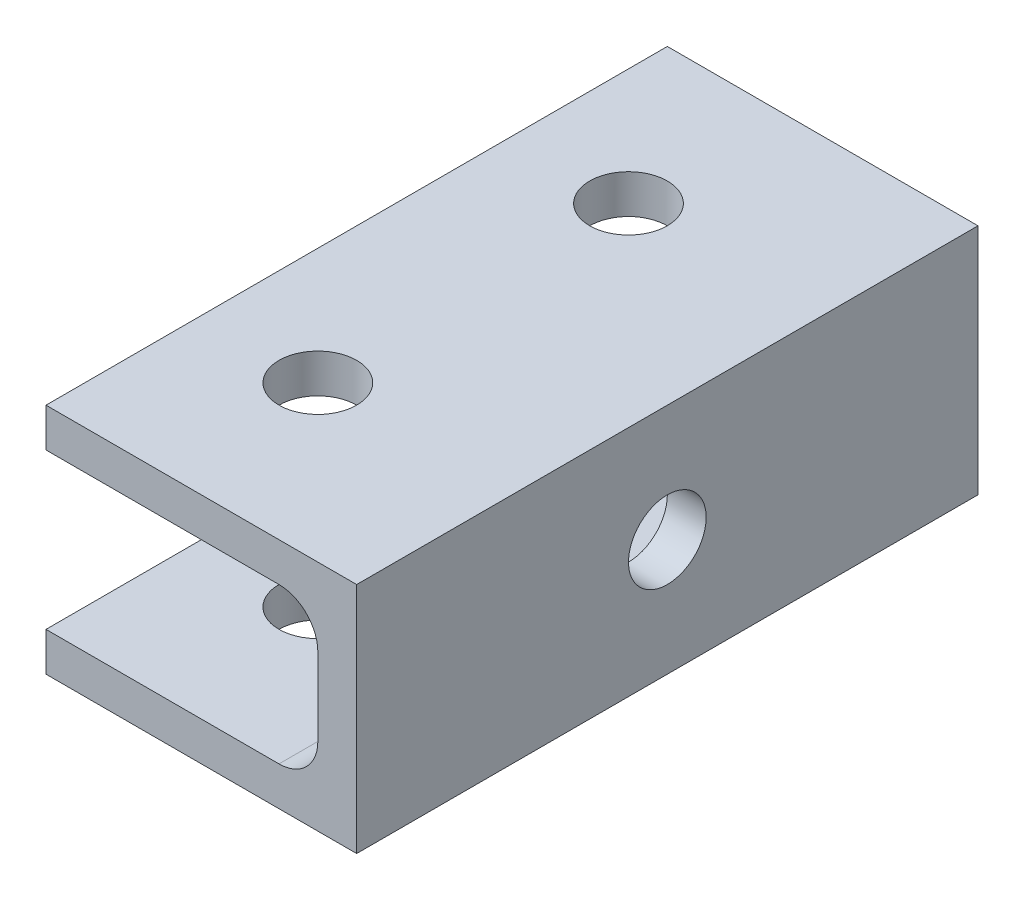
ISO-10303-21;
HEADER;
FILE_DESCRIPTION(('STEP AP214'),'2;1');
FILE_NAME('part.step','',(''),(''),'','','');
FILE_SCHEMA(('AUTOMOTIVE_DESIGN { 1 0 10303 214 1 1 1 1 }'));
ENDSEC;
DATA;
#1=APPLICATION_CONTEXT('core data for automotive mechanical design processes');
#2=APPLICATION_PROTOCOL_DEFINITION('international standard','automotive_design',2000,#1);
#3=PRODUCT_CONTEXT('',#1,'mechanical');
#4=PRODUCT('Part','Part','',(#3));
#5=PRODUCT_RELATED_PRODUCT_CATEGORY('part','',(#4));
#6=PRODUCT_DEFINITION_FORMATION('','',#4);
#7=PRODUCT_DEFINITION_CONTEXT('part definition',#1,'design');
#8=PRODUCT_DEFINITION('design','',#6,#7);
#9=PRODUCT_DEFINITION_SHAPE('','',#8);
#10=(LENGTH_UNIT() NAMED_UNIT(*) SI_UNIT(.MILLI.,.METRE.));
#11=(NAMED_UNIT(*) PLANE_ANGLE_UNIT() SI_UNIT($,.RADIAN.));
#12=(NAMED_UNIT(*) SI_UNIT($,.STERADIAN.) SOLID_ANGLE_UNIT());
#13=UNCERTAINTY_MEASURE_WITH_UNIT(LENGTH_MEASURE(1.E-05),#10,'distance_accuracy_value','');
#14=(GEOMETRIC_REPRESENTATION_CONTEXT(3) GLOBAL_UNCERTAINTY_ASSIGNED_CONTEXT((#13)) GLOBAL_UNIT_ASSIGNED_CONTEXT((#10,
#11,#12)) REPRESENTATION_CONTEXT('',''));
#15=CARTESIAN_POINT('',(0.,0.,0.));
#16=DIRECTION('',(0.,0.,1.));
#17=DIRECTION('',(1.,0.,0.));
#18=AXIS2_PLACEMENT_3D('',#15,#16,#17);
#19=CARTESIAN_POINT('',(35.,0.,80.));
#20=DIRECTION('',(1.,0.,0.));
#21=DIRECTION('',(0.,1.,0.));
#22=AXIS2_PLACEMENT_3D('',#19,#20,#21);
#23=PLANE('',#22);
#24=DIRECTION('',(0.,0.,-1.));
#25=VECTOR('',#24,1.);
#26=CARTESIAN_POINT('',(35.,-5.,0.));
#27=LINE('',#26,#25);
#28=CARTESIAN_POINT('',(35.,-5.,80.));
#29=VERTEX_POINT('',#28);
#30=CARTESIAN_POINT('',(35.,-5.,40.));
#31=VERTEX_POINT('',#30);
#32=EDGE_CURVE('E127',#29,#31,#27,.T.);
#33=ORIENTED_EDGE('',*,*,#32,.T.);
#34=CARTESIAN_POINT('',(35.,-10.,40.));
#35=DIRECTION('',(1.,0.,0.));
#36=DIRECTION('',(0.,1.,0.));
#37=AXIS2_PLACEMENT_3D('',#34,#35,#36);
#38=CIRCLE('',#37,5.);
#39=CARTESIAN_POINT('',(35.,-15.,40.));
#40=VERTEX_POINT('',#39);
#41=EDGE_CURVE('E47',#31,#40,#38,.T.);
#42=ORIENTED_EDGE('',*,*,#41,.T.);
#43=DIRECTION('',(0.,0.,-1.));
#44=VECTOR('',#43,1.);
#45=CARTESIAN_POINT('',(35.,-15.,80.));
#46=LINE('',#45,#44);
#47=CARTESIAN_POINT('',(35.,-15.,80.));
#48=VERTEX_POINT('',#47);
#49=EDGE_CURVE('E124',#40,#48,#46,.F.);
#50=ORIENTED_EDGE('',*,*,#49,.T.);
#51=DIRECTION('',(0.,-1.,0.));
#52=VECTOR('',#51,1.);
#53=CARTESIAN_POINT('',(35.,0.,80.));
#54=LINE('',#53,#52);
#55=EDGE_CURVE('E165',#29,#48,#54,.T.);
#56=ORIENTED_EDGE('',*,*,#55,.F.);
#57=EDGE_LOOP('',(#33,#42,#50,#56));
#58=FACE_BOUND('',#57,.T.);
#59=ADVANCED_FACE('F33',(#58),#23,.F.);
#60=CARTESIAN_POINT('',(0.,0.,80.));
#61=DIRECTION('',(0.,1.,0.));
#62=DIRECTION('',(0.,0.,1.));
#63=AXIS2_PLACEMENT_3D('',#60,#61,#62);
#64=PLANE('',#63);
#65=DIRECTION('',(1.,0.,0.));
#66=VECTOR('',#65,1.);
#67=CARTESIAN_POINT('',(0.,0.,0.));
#68=LINE('',#67,#66);
#69=CARTESIAN_POINT('',(0.,0.,0.));
#70=VERTEX_POINT('',#69);
#71=CARTESIAN_POINT('',(30.,0.,0.));
#72=VERTEX_POINT('',#71);
#73=EDGE_CURVE('E151',#70,#72,#68,.T.);
#74=ORIENTED_EDGE('',*,*,#73,.T.);
#75=DIRECTION('',(0.,0.,-1.));
#76=VECTOR('',#75,1.);
#77=CARTESIAN_POINT('',(30.,0.,80.));
#78=LINE('',#77,#76);
#79=CARTESIAN_POINT('',(30.,0.,80.));
#80=VERTEX_POINT('',#79);
#81=EDGE_CURVE('E55',#72,#80,#78,.F.);
#82=ORIENTED_EDGE('',*,*,#81,.T.);
#83=DIRECTION('',(1.,0.,0.));
#84=VECTOR('',#83,1.);
#85=CARTESIAN_POINT('',(0.,0.,80.));
#86=LINE('',#85,#84);
#87=CARTESIAN_POINT('',(0.,0.,80.));
#88=VERTEX_POINT('',#87);
#89=EDGE_CURVE('E166',#88,#80,#86,.T.);
#90=ORIENTED_EDGE('',*,*,#89,.F.);
#91=DIRECTION('',(0.,0.,-1.));
#92=VECTOR('',#91,1.);
#93=CARTESIAN_POINT('',(0.,0.,80.));
#94=LINE('',#93,#92);
#95=EDGE_CURVE('E157',#88,#70,#94,.T.);
#96=ORIENTED_EDGE('',*,*,#95,.T.);
#97=EDGE_LOOP('',(#74,#82,#90,#96));
#98=FACE_BOUND('',#97,.T.);
#99=CARTESIAN_POINT('',(15.,0.,20.));
#100=DIRECTION('',(0.,1.,0.));
#101=DIRECTION('',(0.,0.,1.));
#102=AXIS2_PLACEMENT_3D('',#99,#100,#101);
#103=CIRCLE('',#102,5.);
#104=CARTESIAN_POINT('',(15.,0.,25.));
#105=VERTEX_POINT('',#104);
#106=EDGE_CURVE('E253',#105,#105,#103,.F.);
#107=ORIENTED_EDGE('',*,*,#106,.F.);
#108=EDGE_LOOP('',(#107));
#109=FACE_BOUND('',#108,.T.);
#110=CARTESIAN_POINT('',(15.,0.,60.));
#111=DIRECTION('',(0.,1.,0.));
#112=DIRECTION('',(0.,0.,1.));
#113=AXIS2_PLACEMENT_3D('',#110,#111,#112);
#114=CIRCLE('',#113,5.);
#115=CARTESIAN_POINT('',(15.,0.,65.));
#116=VERTEX_POINT('',#115);
#117=EDGE_CURVE('E183',#116,#116,#114,.T.);
#118=ORIENTED_EDGE('',*,*,#117,.T.);
#119=EDGE_LOOP('',(#118));
#120=FACE_BOUND('',#119,.T.);
#121=ADVANCED_FACE('F154',(#98,#109,#120),#64,.F.);
#122=CARTESIAN_POINT('',(35.,-20.,80.));
#123=DIRECTION('',(0.,-1.,0.));
#124=DIRECTION('',(1.,0.,0.));
#125=AXIS2_PLACEMENT_3D('',#122,#123,#124);
#126=PLANE('',#125);
#127=DIRECTION('',(-1.,0.,0.));
#128=VECTOR('',#127,1.);
#129=CARTESIAN_POINT('',(35.,-20.,80.));
#130=LINE('',#129,#128);
#131=CARTESIAN_POINT('',(30.,-20.,80.));
#132=VERTEX_POINT('',#131);
#133=CARTESIAN_POINT('',(0.,-20.,80.));
#134=VERTEX_POINT('',#133);
#135=EDGE_CURVE('E167',#132,#134,#130,.T.);
#136=ORIENTED_EDGE('',*,*,#135,.F.);
#137=DIRECTION('',(0.,0.,-1.));
#138=VECTOR('',#137,1.);
#139=CARTESIAN_POINT('',(30.,-20.,0.));
#140=LINE('',#139,#138);
#141=CARTESIAN_POINT('',(30.,-20.,0.));
#142=VERTEX_POINT('',#141);
#143=EDGE_CURVE('E210',#132,#142,#140,.T.);
#144=ORIENTED_EDGE('',*,*,#143,.T.);
#145=DIRECTION('',(-1.,0.,0.));
#146=VECTOR('',#145,1.);
#147=CARTESIAN_POINT('',(35.,-20.,0.));
#148=LINE('',#147,#146);
#149=CARTESIAN_POINT('',(0.,-20.,0.));
#150=VERTEX_POINT('',#149);
#151=EDGE_CURVE('E186',#142,#150,#148,.T.);
#152=ORIENTED_EDGE('',*,*,#151,.T.);
#153=DIRECTION('',(0.,0.,-1.));
#154=VECTOR('',#153,1.);
#155=CARTESIAN_POINT('',(0.,-20.,80.));
#156=LINE('',#155,#154);
#157=EDGE_CURVE('E207',#134,#150,#156,.T.);
#158=ORIENTED_EDGE('',*,*,#157,.F.);
#159=EDGE_LOOP('',(#136,#144,#152,#158));
#160=FACE_BOUND('',#159,.T.);
#161=CARTESIAN_POINT('',(15.,-20.,20.));
#162=DIRECTION('',(0.,-1.,0.));
#163=DIRECTION('',(1.,0.,0.));
#164=AXIS2_PLACEMENT_3D('',#161,#162,#163);
#165=CIRCLE('',#164,5.);
#166=CARTESIAN_POINT('',(20.,-20.,20.));
#167=VERTEX_POINT('',#166);
#168=EDGE_CURVE('E256',#167,#167,#165,.F.);
#169=ORIENTED_EDGE('',*,*,#168,.F.);
#170=EDGE_LOOP('',(#169));
#171=FACE_BOUND('',#170,.T.);
#172=CARTESIAN_POINT('',(15.,-20.,60.));
#173=DIRECTION('',(0.,-1.,0.));
#174=DIRECTION('',(1.,0.,0.));
#175=AXIS2_PLACEMENT_3D('',#172,#173,#174);
#176=CIRCLE('',#175,5.);
#177=CARTESIAN_POINT('',(20.,-20.,60.));
#178=VERTEX_POINT('',#177);
#179=EDGE_CURVE('E247',#178,#178,#176,.T.);
#180=ORIENTED_EDGE('',*,*,#179,.T.);
#181=EDGE_LOOP('',(#180));
#182=FACE_BOUND('',#181,.T.);
#183=ADVANCED_FACE('F216',(#160,#171,#182),#126,.F.);
#184=CARTESIAN_POINT('',(0.,-25.,80.));
#185=DIRECTION('',(0.,1.,0.));
#186=DIRECTION('',(0.,0.,1.));
#187=AXIS2_PLACEMENT_3D('',#184,#185,#186);
#188=PLANE('',#187);
#189=DIRECTION('',(1.,0.,0.));
#190=VECTOR('',#189,1.);
#191=CARTESIAN_POINT('',(0.,-25.,0.));
#192=LINE('',#191,#190);
#193=CARTESIAN_POINT('',(0.,-25.,0.));
#194=VERTEX_POINT('',#193);
#195=CARTESIAN_POINT('',(40.,-25.,0.));
#196=VERTEX_POINT('',#195);
#197=EDGE_CURVE('E190',#194,#196,#192,.T.);
#198=ORIENTED_EDGE('',*,*,#197,.T.);
#199=DIRECTION('',(0.,0.,-1.));
#200=VECTOR('',#199,1.);
#201=CARTESIAN_POINT('',(40.,-25.,80.));
#202=LINE('',#201,#200);
#203=CARTESIAN_POINT('',(40.,-25.,80.));
#204=VERTEX_POINT('',#203);
#205=EDGE_CURVE('E201',#204,#196,#202,.T.);
#206=ORIENTED_EDGE('',*,*,#205,.F.);
#207=DIRECTION('',(1.,0.,0.));
#208=VECTOR('',#207,1.);
#209=CARTESIAN_POINT('',(0.,-25.,80.));
#210=LINE('',#209,#208);
#211=CARTESIAN_POINT('',(0.,-25.,80.));
#212=VERTEX_POINT('',#211);
#213=EDGE_CURVE('E176',#212,#204,#210,.T.);
#214=ORIENTED_EDGE('',*,*,#213,.F.);
#215=DIRECTION('',(0.,0.,-1.));
#216=VECTOR('',#215,1.);
#217=CARTESIAN_POINT('',(0.,-25.,80.));
#218=LINE('',#217,#216);
#219=EDGE_CURVE('E204',#212,#194,#218,.T.);
#220=ORIENTED_EDGE('',*,*,#219,.T.);
#221=EDGE_LOOP('',(#198,#206,#214,#220));
#222=FACE_BOUND('',#221,.T.);
#223=CARTESIAN_POINT('',(15.,-25.,20.));
#224=DIRECTION('',(0.,1.,0.));
#225=DIRECTION('',(0.,0.,1.));
#226=AXIS2_PLACEMENT_3D('',#223,#224,#225);
#227=CIRCLE('',#226,5.);
#228=CARTESIAN_POINT('',(15.,-25.,25.));
#229=VERTEX_POINT('',#228);
#230=EDGE_CURVE('E259',#229,#229,#227,.F.);
#231=ORIENTED_EDGE('',*,*,#230,.F.);
#232=EDGE_LOOP('',(#231));
#233=FACE_BOUND('',#232,.T.);
#234=CARTESIAN_POINT('',(15.,-25.,60.));
#235=DIRECTION('',(0.,1.,0.));
#236=DIRECTION('',(0.,0.,1.));
#237=AXIS2_PLACEMENT_3D('',#234,#235,#236);
#238=CIRCLE('',#237,5.);
#239=CARTESIAN_POINT('',(15.,-25.,65.));
#240=VERTEX_POINT('',#239);
#241=EDGE_CURVE('E250',#240,#240,#238,.T.);
#242=ORIENTED_EDGE('',*,*,#241,.T.);
#243=EDGE_LOOP('',(#242));
#244=FACE_BOUND('',#243,.T.);
#245=ADVANCED_FACE('F228',(#222,#233,#244),#188,.F.);
#246=CARTESIAN_POINT('',(40.,5.00000000000001,80.));
#247=DIRECTION('',(0.,-1.,0.));
#248=DIRECTION('',(1.,0.,0.));
#249=AXIS2_PLACEMENT_3D('',#246,#247,#248);
#250=PLANE('',#249);
#251=DIRECTION('',(-1.,0.,0.));
#252=VECTOR('',#251,1.);
#253=CARTESIAN_POINT('',(40.,5.00000000000001,0.));
#254=LINE('',#253,#252);
#255=CARTESIAN_POINT('',(40.,5.00000000000001,0.));
#256=VERTEX_POINT('',#255);
#257=CARTESIAN_POINT('',(0.,5.,0.));
#258=VERTEX_POINT('',#257);
#259=EDGE_CURVE('E194',#256,#258,#254,.T.);
#260=ORIENTED_EDGE('',*,*,#259,.T.);
#261=DIRECTION('',(0.,0.,-1.));
#262=VECTOR('',#261,1.);
#263=CARTESIAN_POINT('',(0.,5.,80.));
#264=LINE('',#263,#262);
#265=CARTESIAN_POINT('',(0.,5.,80.));
#266=VERTEX_POINT('',#265);
#267=EDGE_CURVE('E182',#266,#258,#264,.T.);
#268=ORIENTED_EDGE('',*,*,#267,.F.);
#269=DIRECTION('',(-1.,0.,0.));
#270=VECTOR('',#269,1.);
#271=CARTESIAN_POINT('',(40.,5.00000000000001,80.));
#272=LINE('',#271,#270);
#273=CARTESIAN_POINT('',(40.,5.00000000000001,80.));
#274=VERTEX_POINT('',#273);
#275=EDGE_CURVE('E180',#274,#266,#272,.T.);
#276=ORIENTED_EDGE('',*,*,#275,.F.);
#277=DIRECTION('',(0.,0.,-1.));
#278=VECTOR('',#277,1.);
#279=CARTESIAN_POINT('',(40.,5.00000000000001,80.));
#280=LINE('',#279,#278);
#281=EDGE_CURVE('E198',#274,#256,#280,.T.);
#282=ORIENTED_EDGE('',*,*,#281,.T.);
#283=EDGE_LOOP('',(#260,#268,#276,#282));
#284=FACE_BOUND('',#283,.T.);
#285=CARTESIAN_POINT('',(15.,5.,20.));
#286=DIRECTION('',(0.,-1.,0.));
#287=DIRECTION('',(1.,0.,0.));
#288=AXIS2_PLACEMENT_3D('',#285,#286,#287);
#289=CIRCLE('',#288,5.);
#290=CARTESIAN_POINT('',(20.,5.,20.));
#291=VERTEX_POINT('',#290);
#292=EDGE_CURVE('E128',#291,#291,#289,.T.);
#293=ORIENTED_EDGE('',*,*,#292,.T.);
#294=EDGE_LOOP('',(#293));
#295=FACE_BOUND('',#294,.T.);
#296=CARTESIAN_POINT('',(15.,5.,60.));
#297=DIRECTION('',(0.,1.,0.));
#298=DIRECTION('',(-1.,0.,0.));
#299=AXIS2_PLACEMENT_3D('',#296,#297,#298);
#300=CIRCLE('',#299,5.);
#301=CARTESIAN_POINT('',(10.,5.,60.));
#302=VERTEX_POINT('',#301);
#303=EDGE_CURVE('E262',#302,#302,#300,.T.);
#304=ORIENTED_EDGE('',*,*,#303,.F.);
#305=EDGE_LOOP('',(#304));
#306=FACE_BOUND('',#305,.T.);
#307=ADVANCED_FACE('F239',(#284,#295,#306),#250,.F.);
#308=CARTESIAN_POINT('',(0.,5.,80.));
#309=DIRECTION('',(1.,0.,0.));
#310=DIRECTION('',(0.,0.,-1.));
#311=AXIS2_PLACEMENT_3D('',#308,#309,#310);
#312=PLANE('',#311);
#313=DIRECTION('',(0.,-1.,0.));
#314=VECTOR('',#313,1.);
#315=CARTESIAN_POINT('',(0.,5.,0.));
#316=LINE('',#315,#314);
#317=EDGE_CURVE('E159',#258,#70,#316,.T.);
#318=ORIENTED_EDGE('',*,*,#317,.T.);
#319=ORIENTED_EDGE('',*,*,#95,.F.);
#320=DIRECTION('',(0.,-1.,0.));
#321=VECTOR('',#320,1.);
#322=CARTESIAN_POINT('',(0.,5.,80.));
#323=LINE('',#322,#321);
#324=EDGE_CURVE('E171',#266,#88,#323,.T.);
#325=ORIENTED_EDGE('',*,*,#324,.F.);
#326=ORIENTED_EDGE('',*,*,#267,.T.);
#327=EDGE_LOOP('',(#318,#319,#325,#326));
#328=FACE_BOUND('',#327,.T.);
#329=ADVANCED_FACE('F243',(#328),#312,.F.);
#330=CARTESIAN_POINT('',(35.,-15.,0.));
#331=VERTEX_POINT('',#330);
#332=EDGE_CURVE('E133',#331,#40,#46,.F.);
#333=ORIENTED_EDGE('',*,*,#332,.T.);
#334=EDGE_CURVE('E113',#40,#31,#38,.T.);
#335=ORIENTED_EDGE('',*,*,#334,.T.);
#336=CARTESIAN_POINT('',(35.,-5.,0.));
#337=VERTEX_POINT('',#336);
#338=EDGE_CURVE('E212',#31,#337,#27,.T.);
#339=ORIENTED_EDGE('',*,*,#338,.T.);
#340=DIRECTION('',(0.,-1.,0.));
#341=VECTOR('',#340,1.);
#342=CARTESIAN_POINT('',(35.,0.,0.));
#343=LINE('',#342,#341);
#344=EDGE_CURVE('E140',#337,#331,#343,.T.);
#345=ORIENTED_EDGE('',*,*,#344,.T.);
#346=EDGE_LOOP('',(#333,#335,#339,#345));
#347=FACE_BOUND('',#346,.T.);
#348=ADVANCED_FACE('F138',(#347),#23,.F.);
#349=CARTESIAN_POINT('',(0.,-20.,80.));
#350=DIRECTION('',(1.,0.,0.));
#351=DIRECTION('',(0.,1.,0.));
#352=AXIS2_PLACEMENT_3D('',#349,#350,#351);
#353=PLANE('',#352);
#354=DIRECTION('',(0.,-1.,0.));
#355=VECTOR('',#354,1.);
#356=CARTESIAN_POINT('',(0.,-20.,0.));
#357=LINE('',#356,#355);
#358=EDGE_CURVE('E188',#150,#194,#357,.T.);
#359=ORIENTED_EDGE('',*,*,#358,.T.);
#360=ORIENTED_EDGE('',*,*,#219,.F.);
#361=DIRECTION('',(0.,-1.,0.));
#362=VECTOR('',#361,1.);
#363=CARTESIAN_POINT('',(0.,-20.,80.));
#364=LINE('',#363,#362);
#365=EDGE_CURVE('E169',#134,#212,#364,.T.);
#366=ORIENTED_EDGE('',*,*,#365,.F.);
#367=ORIENTED_EDGE('',*,*,#157,.T.);
#368=EDGE_LOOP('',(#359,#360,#366,#367));
#369=FACE_BOUND('',#368,.T.);
#370=ADVANCED_FACE('F224',(#369),#353,.F.);
#371=CARTESIAN_POINT('',(40.,-25.,80.));
#372=DIRECTION('',(-1.,0.,0.));
#373=DIRECTION('',(0.,0.,1.));
#374=AXIS2_PLACEMENT_3D('',#371,#372,#373);
#375=PLANE('',#374);
#376=CARTESIAN_POINT('',(40.,-10.,40.));
#377=DIRECTION('',(1.,0.,0.));
#378=DIRECTION('',(0.,0.,-1.));
#379=AXIS2_PLACEMENT_3D('',#376,#377,#378);
#380=CIRCLE('',#379,5.);
#381=CARTESIAN_POINT('',(40.,-10.,35.));
#382=VERTEX_POINT('',#381);
#383=EDGE_CURVE('E118',#382,#382,#380,.T.);
#384=ORIENTED_EDGE('',*,*,#383,.F.);
#385=EDGE_LOOP('',(#384));
#386=FACE_BOUND('',#385,.T.);
#387=DIRECTION('',(0.,1.,0.));
#388=VECTOR('',#387,1.);
#389=CARTESIAN_POINT('',(40.,-25.,0.));
#390=LINE('',#389,#388);
#391=EDGE_CURVE('E192',#196,#256,#390,.T.);
#392=ORIENTED_EDGE('',*,*,#391,.T.);
#393=ORIENTED_EDGE('',*,*,#281,.F.);
#394=DIRECTION('',(0.,1.,0.));
#395=VECTOR('',#394,1.);
#396=CARTESIAN_POINT('',(40.,-25.,80.));
#397=LINE('',#396,#395);
#398=EDGE_CURVE('E178',#204,#274,#397,.T.);
#399=ORIENTED_EDGE('',*,*,#398,.F.);
#400=ORIENTED_EDGE('',*,*,#205,.T.);
#401=EDGE_LOOP('',(#392,#393,#399,#400));
#402=FACE_BOUND('',#401,.T.);
#403=ADVANCED_FACE('F236',(#386,#402),#375,.F.);
#404=CARTESIAN_POINT('',(0.,0.,80.));
#405=DIRECTION('',(0.,0.,1.));
#406=DIRECTION('',(1.,0.,0.));
#407=AXIS2_PLACEMENT_3D('',#404,#405,#406);
#408=PLANE('',#407);
#409=ORIENTED_EDGE('',*,*,#324,.T.);
#410=ORIENTED_EDGE('',*,*,#89,.T.);
#411=CARTESIAN_POINT('',(30.,-5.,80.));
#412=DIRECTION('',(0.,0.,1.));
#413=DIRECTION('',(1.,0.,0.));
#414=AXIS2_PLACEMENT_3D('',#411,#412,#413);
#415=CIRCLE('',#414,5.);
#416=EDGE_CURVE('E11',#80,#29,#415,.F.);
#417=ORIENTED_EDGE('',*,*,#416,.T.);
#418=ORIENTED_EDGE('',*,*,#55,.T.);
#419=CARTESIAN_POINT('',(30.,-15.,80.));
#420=DIRECTION('',(0.,0.,1.));
#421=DIRECTION('',(1.,0.,0.));
#422=AXIS2_PLACEMENT_3D('',#419,#420,#421);
#423=CIRCLE('',#422,5.);
#424=EDGE_CURVE('E135',#48,#132,#423,.F.);
#425=ORIENTED_EDGE('',*,*,#424,.T.);
#426=ORIENTED_EDGE('',*,*,#135,.T.);
#427=ORIENTED_EDGE('',*,*,#365,.T.);
#428=ORIENTED_EDGE('',*,*,#213,.T.);
#429=ORIENTED_EDGE('',*,*,#398,.T.);
#430=ORIENTED_EDGE('',*,*,#275,.T.);
#431=EDGE_LOOP('',(#409,#410,#417,#418,#425,#426,#427,#428,#429,#430));
#432=FACE_BOUND('',#431,.T.);
#433=ADVANCED_FACE('F164',(#432),#408,.T.);
#434=CARTESIAN_POINT('',(0.,0.,0.));
#435=DIRECTION('',(0.,0.,1.));
#436=DIRECTION('',(1.,0.,0.));
#437=AXIS2_PLACEMENT_3D('',#434,#435,#436);
#438=PLANE('',#437);
#439=ORIENTED_EDGE('',*,*,#317,.F.);
#440=ORIENTED_EDGE('',*,*,#259,.F.);
#441=ORIENTED_EDGE('',*,*,#391,.F.);
#442=ORIENTED_EDGE('',*,*,#197,.F.);
#443=ORIENTED_EDGE('',*,*,#358,.F.);
#444=ORIENTED_EDGE('',*,*,#151,.F.);
#445=CARTESIAN_POINT('',(30.,-15.,0.));
#446=DIRECTION('',(0.,0.,1.));
#447=DIRECTION('',(1.,0.,0.));
#448=AXIS2_PLACEMENT_3D('',#445,#446,#447);
#449=CIRCLE('',#448,5.);
#450=EDGE_CURVE('E141',#142,#331,#449,.T.);
#451=ORIENTED_EDGE('',*,*,#450,.T.);
#452=ORIENTED_EDGE('',*,*,#344,.F.);
#453=CARTESIAN_POINT('',(30.,-5.,0.));
#454=DIRECTION('',(0.,0.,1.));
#455=DIRECTION('',(1.,0.,0.));
#456=AXIS2_PLACEMENT_3D('',#453,#454,#455);
#457=CIRCLE('',#456,5.);
#458=EDGE_CURVE('E41',#337,#72,#457,.T.);
#459=ORIENTED_EDGE('',*,*,#458,.T.);
#460=ORIENTED_EDGE('',*,*,#73,.F.);
#461=EDGE_LOOP('',(#439,#440,#441,#442,#443,#444,#451,#452,#459,#460));
#462=FACE_BOUND('',#461,.T.);
#463=ADVANCED_FACE('F150',(#462),#438,.F.);
#464=CARTESIAN_POINT('',(30.,-15.,80.));
#465=DIRECTION('',(0.,0.,1.));
#466=DIRECTION('',(1.,0.,0.));
#467=AXIS2_PLACEMENT_3D('',#464,#465,#466);
#468=CYLINDRICAL_SURFACE('',#467,5.);
#469=ORIENTED_EDGE('',*,*,#424,.F.);
#470=ORIENTED_EDGE('',*,*,#49,.F.);
#471=ORIENTED_EDGE('',*,*,#332,.F.);
#472=ORIENTED_EDGE('',*,*,#450,.F.);
#473=ORIENTED_EDGE('',*,*,#143,.F.);
#474=EDGE_LOOP('',(#469,#470,#471,#472,#473));
#475=FACE_BOUND('',#474,.T.);
#476=ADVANCED_FACE('F132',(#475),#468,.F.);
#477=CARTESIAN_POINT('',(30.,-5.,80.));
#478=DIRECTION('',(0.,0.,1.));
#479=DIRECTION('',(1.,0.,0.));
#480=AXIS2_PLACEMENT_3D('',#477,#478,#479);
#481=CYLINDRICAL_SURFACE('',#480,5.);
#482=ORIENTED_EDGE('',*,*,#416,.F.);
#483=ORIENTED_EDGE('',*,*,#81,.F.);
#484=ORIENTED_EDGE('',*,*,#458,.F.);
#485=ORIENTED_EDGE('',*,*,#338,.F.);
#486=ORIENTED_EDGE('',*,*,#32,.F.);
#487=EDGE_LOOP('',(#482,#483,#484,#485,#486));
#488=FACE_BOUND('',#487,.T.);
#489=ADVANCED_FACE('F35',(#488),#481,.F.);
#490=CARTESIAN_POINT('',(15.,-70.,20.));
#491=DIRECTION('',(0.,1.,0.));
#492=DIRECTION('',(-1.,0.,0.));
#493=AXIS2_PLACEMENT_3D('',#490,#491,#492);
#494=CYLINDRICAL_SURFACE('',#493,5.);
#495=ORIENTED_EDGE('',*,*,#292,.F.);
#496=EDGE_LOOP('',(#495));
#497=FACE_BOUND('',#496,.T.);
#498=ORIENTED_EDGE('',*,*,#106,.T.);
#499=EDGE_LOOP('',(#498));
#500=FACE_BOUND('',#499,.T.);
#501=ADVANCED_FACE('F301',(#497,#500),#494,.F.);
#502=CARTESIAN_POINT('',(15.,-70.,60.));
#503=DIRECTION('',(0.,1.,0.));
#504=DIRECTION('',(-1.,0.,0.));
#505=AXIS2_PLACEMENT_3D('',#502,#503,#504);
#506=CYLINDRICAL_SURFACE('',#505,5.);
#507=ORIENTED_EDGE('',*,*,#303,.T.);
#508=EDGE_LOOP('',(#507));
#509=FACE_BOUND('',#508,.T.);
#510=ORIENTED_EDGE('',*,*,#117,.F.);
#511=EDGE_LOOP('',(#510));
#512=FACE_BOUND('',#511,.T.);
#513=ADVANCED_FACE('F308',(#509,#512),#506,.F.);
#514=ORIENTED_EDGE('',*,*,#230,.T.);
#515=EDGE_LOOP('',(#514));
#516=FACE_BOUND('',#515,.T.);
#517=ORIENTED_EDGE('',*,*,#168,.T.);
#518=EDGE_LOOP('',(#517));
#519=FACE_BOUND('',#518,.T.);
#520=ADVANCED_FACE('F310',(#516,#519),#494,.F.);
#521=ORIENTED_EDGE('',*,*,#241,.F.);
#522=EDGE_LOOP('',(#521));
#523=FACE_BOUND('',#522,.T.);
#524=ORIENTED_EDGE('',*,*,#179,.F.);
#525=EDGE_LOOP('',(#524));
#526=FACE_BOUND('',#525,.T.);
#527=ADVANCED_FACE('F314',(#523,#526),#506,.F.);
#528=CARTESIAN_POINT('',(30.,-10.,40.));
#529=DIRECTION('',(1.,0.,0.));
#530=DIRECTION('',(0.,0.,-1.));
#531=AXIS2_PLACEMENT_3D('',#528,#529,#530);
#532=CYLINDRICAL_SURFACE('',#531,5.);
#533=ORIENTED_EDGE('',*,*,#383,.T.);
#534=EDGE_LOOP('',(#533));
#535=FACE_BOUND('',#534,.T.);
#536=ORIENTED_EDGE('',*,*,#334,.F.);
#537=ORIENTED_EDGE('',*,*,#41,.F.);
#538=EDGE_LOOP('',(#536,#537));
#539=FACE_BOUND('',#538,.T.);
#540=ADVANCED_FACE('F114',(#535,#539),#532,.F.);
#541=CLOSED_SHELL('',(#59,#121,#183,#245,#307,#329,#348,#370,#403,#433,#463,#476,#489,#501,#513,
#520,#527,#540));
#542=MANIFOLD_SOLID_BREP('B2',#541);
#543=ADVANCED_BREP_SHAPE_REPRESENTATION('',(#18,#542),#14);
#544=SHAPE_DEFINITION_REPRESENTATION(#9,#543);
ENDSEC;
END-ISO-10303-21;
